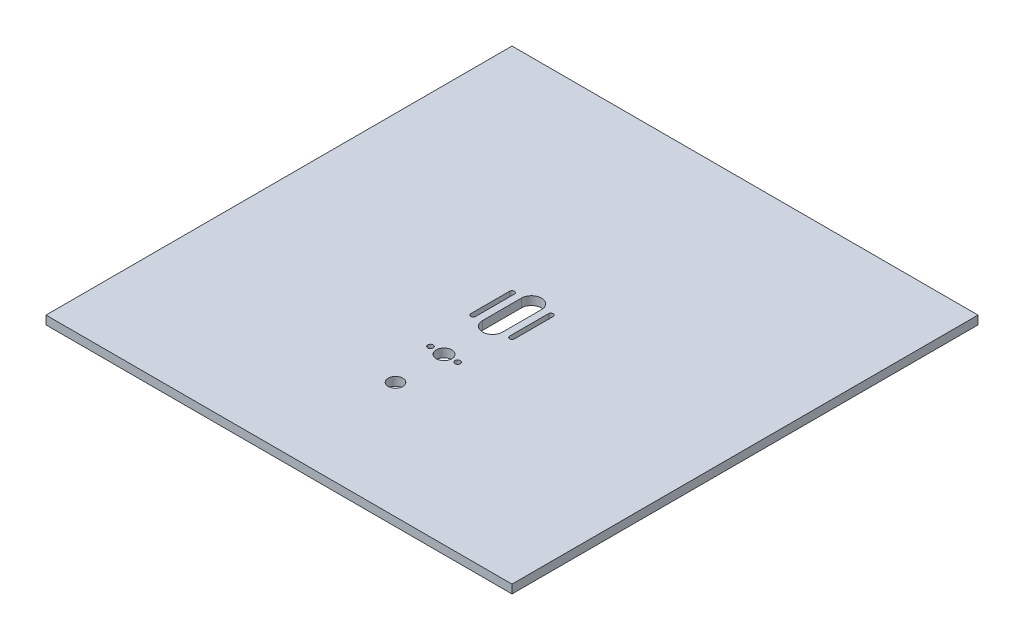
ISO-10303-21;
HEADER;
FILE_DESCRIPTION(('STEP AP214'),'2;1');
FILE_NAME('part.step','',(''),(''),'','','');
FILE_SCHEMA(('AUTOMOTIVE_DESIGN { 1 0 10303 214 1 1 1 1 }'));
ENDSEC;
DATA;
#1=APPLICATION_CONTEXT('core data for automotive mechanical design processes');
#2=APPLICATION_PROTOCOL_DEFINITION('international standard','automotive_design',2000,#1);
#3=PRODUCT_CONTEXT('',#1,'mechanical');
#4=PRODUCT('Part','Part','',(#3));
#5=PRODUCT_RELATED_PRODUCT_CATEGORY('part','',(#4));
#6=PRODUCT_DEFINITION_FORMATION('','',#4);
#7=PRODUCT_DEFINITION_CONTEXT('part definition',#1,'design');
#8=PRODUCT_DEFINITION('design','',#6,#7);
#9=PRODUCT_DEFINITION_SHAPE('','',#8);
#10=(LENGTH_UNIT() NAMED_UNIT(*) SI_UNIT(.MILLI.,.METRE.));
#11=(NAMED_UNIT(*) PLANE_ANGLE_UNIT() SI_UNIT($,.RADIAN.));
#12=(NAMED_UNIT(*) SI_UNIT($,.STERADIAN.) SOLID_ANGLE_UNIT());
#13=UNCERTAINTY_MEASURE_WITH_UNIT(LENGTH_MEASURE(1.E-05),#10,'distance_accuracy_value','');
#14=(GEOMETRIC_REPRESENTATION_CONTEXT(3) GLOBAL_UNCERTAINTY_ASSIGNED_CONTEXT((#13)) GLOBAL_UNIT_ASSIGNED_CONTEXT((#10,
#11,#12)) REPRESENTATION_CONTEXT('',''));
#15=CARTESIAN_POINT('',(0.,0.,0.));
#16=DIRECTION('',(0.,0.,1.));
#17=DIRECTION('',(1.,0.,0.));
#18=AXIS2_PLACEMENT_3D('',#15,#16,#17);
#19=CARTESIAN_POINT('',(152.4,5.588,152.4));
#20=DIRECTION('',(-1.,0.,0.));
#21=DIRECTION('',(0.,0.,1.));
#22=AXIS2_PLACEMENT_3D('',#19,#20,#21);
#23=PLANE('',#22);
#24=DIRECTION('',(0.,0.,-1.));
#25=VECTOR('',#24,1.);
#26=CARTESIAN_POINT('',(152.4,0.,152.4));
#27=LINE('',#26,#25);
#28=CARTESIAN_POINT('',(152.4,0.,152.4));
#29=VERTEX_POINT('',#28);
#30=CARTESIAN_POINT('',(152.4,0.,-152.4));
#31=VERTEX_POINT('',#30);
#32=EDGE_CURVE('E253',#29,#31,#27,.T.);
#33=ORIENTED_EDGE('',*,*,#32,.T.);
#34=DIRECTION('',(0.,-1.,0.));
#35=VECTOR('',#34,1.);
#36=CARTESIAN_POINT('',(152.4,5.588,-152.4));
#37=LINE('',#36,#35);
#38=CARTESIAN_POINT('',(152.4,5.588,-152.4));
#39=VERTEX_POINT('',#38);
#40=EDGE_CURVE('E11',#39,#31,#37,.T.);
#41=ORIENTED_EDGE('',*,*,#40,.F.);
#42=DIRECTION('',(0.,0.,-1.));
#43=VECTOR('',#42,1.);
#44=CARTESIAN_POINT('',(152.4,5.588,152.4));
#45=LINE('',#44,#43);
#46=CARTESIAN_POINT('',(152.4,5.588,152.4));
#47=VERTEX_POINT('',#46);
#48=EDGE_CURVE('E258',#47,#39,#45,.T.);
#49=ORIENTED_EDGE('',*,*,#48,.F.);
#50=DIRECTION('',(0.,-1.,0.));
#51=VECTOR('',#50,1.);
#52=CARTESIAN_POINT('',(152.4,5.588,152.4));
#53=LINE('',#52,#51);
#54=EDGE_CURVE('E268',#47,#29,#53,.T.);
#55=ORIENTED_EDGE('',*,*,#54,.T.);
#56=EDGE_LOOP('',(#33,#41,#49,#55));
#57=FACE_BOUND('',#56,.T.);
#58=ADVANCED_FACE('F33',(#57),#23,.F.);
#59=CARTESIAN_POINT('',(-152.4,5.588,-152.4));
#60=DIRECTION('',(0.,0.,1.));
#61=DIRECTION('',(1.,0.,0.));
#62=AXIS2_PLACEMENT_3D('',#59,#60,#61);
#63=PLANE('',#62);
#64=DIRECTION('',(-1.,0.,0.));
#65=VECTOR('',#64,1.);
#66=CARTESIAN_POINT('',(-152.4,0.,-152.4));
#67=LINE('',#66,#65);
#68=CARTESIAN_POINT('',(-152.4,0.,-152.4));
#69=VERTEX_POINT('',#68);
#70=EDGE_CURVE('E271',#31,#69,#67,.T.);
#71=ORIENTED_EDGE('',*,*,#70,.T.);
#72=DIRECTION('',(0.,-1.,0.));
#73=VECTOR('',#72,1.);
#74=CARTESIAN_POINT('',(-152.4,5.588,-152.4));
#75=LINE('',#74,#73);
#76=CARTESIAN_POINT('',(-152.4,5.588,-152.4));
#77=VERTEX_POINT('',#76);
#78=EDGE_CURVE('E40',#77,#69,#75,.T.);
#79=ORIENTED_EDGE('',*,*,#78,.F.);
#80=DIRECTION('',(-1.,0.,0.));
#81=VECTOR('',#80,1.);
#82=CARTESIAN_POINT('',(-152.4,5.588,-152.4));
#83=LINE('',#82,#81);
#84=EDGE_CURVE('E261',#39,#77,#83,.T.);
#85=ORIENTED_EDGE('',*,*,#84,.F.);
#86=ORIENTED_EDGE('',*,*,#40,.T.);
#87=EDGE_LOOP('',(#71,#79,#85,#86));
#88=FACE_BOUND('',#87,.T.);
#89=ADVANCED_FACE('F300',(#88),#63,.F.);
#90=CARTESIAN_POINT('',(-152.4,5.588,152.4));
#91=DIRECTION('',(1.,0.,0.));
#92=DIRECTION('',(0.,0.,-1.));
#93=AXIS2_PLACEMENT_3D('',#90,#91,#92);
#94=PLANE('',#93);
#95=DIRECTION('',(0.,0.,1.));
#96=VECTOR('',#95,1.);
#97=CARTESIAN_POINT('',(-152.4,0.,152.4));
#98=LINE('',#97,#96);
#99=CARTESIAN_POINT('',(-152.4,0.,152.4));
#100=VERTEX_POINT('',#99);
#101=EDGE_CURVE('E273',#69,#100,#98,.T.);
#102=ORIENTED_EDGE('',*,*,#101,.T.);
#103=DIRECTION('',(0.,-1.,0.));
#104=VECTOR('',#103,1.);
#105=CARTESIAN_POINT('',(-152.4,5.588,152.4));
#106=LINE('',#105,#104);
#107=CARTESIAN_POINT('',(-152.4,5.588,152.4));
#108=VERTEX_POINT('',#107);
#109=EDGE_CURVE('E278',#108,#100,#106,.T.);
#110=ORIENTED_EDGE('',*,*,#109,.F.);
#111=DIRECTION('',(0.,0.,1.));
#112=VECTOR('',#111,1.);
#113=CARTESIAN_POINT('',(-152.4,5.588,152.4));
#114=LINE('',#113,#112);
#115=EDGE_CURVE('E264',#77,#108,#114,.T.);
#116=ORIENTED_EDGE('',*,*,#115,.F.);
#117=ORIENTED_EDGE('',*,*,#78,.T.);
#118=EDGE_LOOP('',(#102,#110,#116,#117));
#119=FACE_BOUND('',#118,.T.);
#120=ADVANCED_FACE('F285',(#119),#94,.F.);
#121=CARTESIAN_POINT('',(-152.4,5.588,152.4));
#122=DIRECTION('',(0.,0.,-1.));
#123=DIRECTION('',(-1.,0.,0.));
#124=AXIS2_PLACEMENT_3D('',#121,#122,#123);
#125=PLANE('',#124);
#126=DIRECTION('',(1.,0.,0.));
#127=VECTOR('',#126,1.);
#128=CARTESIAN_POINT('',(-152.4,0.,152.4));
#129=LINE('',#128,#127);
#130=EDGE_CURVE('E262',#100,#29,#129,.T.);
#131=ORIENTED_EDGE('',*,*,#130,.T.);
#132=ORIENTED_EDGE('',*,*,#54,.F.);
#133=DIRECTION('',(1.,0.,0.));
#134=VECTOR('',#133,1.);
#135=CARTESIAN_POINT('',(-152.4,5.588,152.4));
#136=LINE('',#135,#134);
#137=EDGE_CURVE('E266',#108,#47,#136,.T.);
#138=ORIENTED_EDGE('',*,*,#137,.F.);
#139=ORIENTED_EDGE('',*,*,#109,.T.);
#140=EDGE_LOOP('',(#131,#132,#138,#139));
#141=FACE_BOUND('',#140,.T.);
#142=ADVANCED_FACE('F293',(#141),#125,.F.);
#143=CARTESIAN_POINT('',(0.,5.588,0.));
#144=DIRECTION('',(0.,-1.,0.));
#145=DIRECTION('',(0.,0.,-1.));
#146=AXIS2_PLACEMENT_3D('',#143,#144,#145);
#147=PLANE('',#146);
#148=CARTESIAN_POINT('',(8.89,5.588,44.45));
#149=DIRECTION('',(0.,1.,0.));
#150=DIRECTION('',(0.,0.,1.));
#151=AXIS2_PLACEMENT_3D('',#148,#149,#150);
#152=CIRCLE('',#151,1.778);
#153=CARTESIAN_POINT('',(8.89,5.588,46.228));
#154=VERTEX_POINT('',#153);
#155=EDGE_CURVE('E243',#154,#154,#152,.T.);
#156=ORIENTED_EDGE('',*,*,#155,.F.);
#157=EDGE_LOOP('',(#156));
#158=FACE_BOUND('',#157,.T.);
#159=CARTESIAN_POINT('',(-8.89,5.588,44.45));
#160=DIRECTION('',(0.,1.,0.));
#161=DIRECTION('',(0.,0.,1.));
#162=AXIS2_PLACEMENT_3D('',#159,#160,#161);
#163=CIRCLE('',#162,1.77799999999999);
#164=CARTESIAN_POINT('',(-8.89,5.588,46.228));
#165=VERTEX_POINT('',#164);
#166=EDGE_CURVE('E382',#165,#165,#163,.T.);
#167=ORIENTED_EDGE('',*,*,#166,.F.);
#168=EDGE_LOOP('',(#167));
#169=FACE_BOUND('',#168,.T.);
#170=CARTESIAN_POINT('',(0.,5.588,44.45));
#171=DIRECTION('',(0.,1.,0.));
#172=DIRECTION('',(0.,0.,1.));
#173=AXIS2_PLACEMENT_3D('',#170,#171,#172);
#174=CIRCLE('',#173,5.08000000000001);
#175=CARTESIAN_POINT('',(0.,5.588,49.53));
#176=VERTEX_POINT('',#175);
#177=EDGE_CURVE('E172',#176,#176,#174,.T.);
#178=ORIENTED_EDGE('',*,*,#177,.F.);
#179=EDGE_LOOP('',(#178));
#180=FACE_BOUND('',#179,.T.);
#181=DIRECTION('',(0.,0.,1.));
#182=VECTOR('',#181,1.);
#183=CARTESIAN_POINT('',(11.1125,5.588,-12.7));
#184=LINE('',#183,#182);
#185=CARTESIAN_POINT('',(11.1125,5.588,-12.7));
#186=VERTEX_POINT('',#185);
#187=CARTESIAN_POINT('',(11.1125,5.588,12.7));
#188=VERTEX_POINT('',#187);
#189=EDGE_CURVE('E204',#186,#188,#184,.T.);
#190=ORIENTED_EDGE('',*,*,#189,.F.);
#191=CARTESIAN_POINT('',(12.7,5.588,-12.7));
#192=DIRECTION('',(0.,1.,0.));
#193=DIRECTION('',(0.,0.,1.));
#194=AXIS2_PLACEMENT_3D('',#191,#192,#193);
#195=CIRCLE('',#194,1.5875);
#196=CARTESIAN_POINT('',(14.2875,5.588,-12.7));
#197=VERTEX_POINT('',#196);
#198=EDGE_CURVE('E47',#197,#186,#195,.T.);
#199=ORIENTED_EDGE('',*,*,#198,.F.);
#200=DIRECTION('',(0.,0.,-1.));
#201=VECTOR('',#200,1.);
#202=CARTESIAN_POINT('',(14.2875,5.588,-12.7));
#203=LINE('',#202,#201);
#204=CARTESIAN_POINT('',(14.2875,5.588,12.7));
#205=VERTEX_POINT('',#204);
#206=EDGE_CURVE('E193',#205,#197,#203,.T.);
#207=ORIENTED_EDGE('',*,*,#206,.F.);
#208=CARTESIAN_POINT('',(12.7,5.588,12.7));
#209=DIRECTION('',(0.,1.,0.));
#210=DIRECTION('',(0.,0.,1.));
#211=AXIS2_PLACEMENT_3D('',#208,#209,#210);
#212=CIRCLE('',#211,1.5875);
#213=EDGE_CURVE('E207',#188,#205,#212,.T.);
#214=ORIENTED_EDGE('',*,*,#213,.F.);
#215=EDGE_LOOP('',(#190,#199,#207,#214));
#216=FACE_BOUND('',#215,.T.);
#217=DIRECTION('',(0.,0.,1.));
#218=VECTOR('',#217,1.);
#219=CARTESIAN_POINT('',(-14.2875,5.588,-12.7));
#220=LINE('',#219,#218);
#221=CARTESIAN_POINT('',(-14.2875,5.588,-12.7));
#222=VERTEX_POINT('',#221);
#223=CARTESIAN_POINT('',(-14.2875,5.588,12.7));
#224=VERTEX_POINT('',#223);
#225=EDGE_CURVE('E178',#222,#224,#220,.T.);
#226=ORIENTED_EDGE('',*,*,#225,.F.);
#227=CARTESIAN_POINT('',(-12.7,5.588,-12.7));
#228=DIRECTION('',(0.,1.,0.));
#229=DIRECTION('',(0.,0.,1.));
#230=AXIS2_PLACEMENT_3D('',#227,#228,#229);
#231=CIRCLE('',#230,1.5875);
#232=CARTESIAN_POINT('',(-11.1125,5.588,-12.7));
#233=VERTEX_POINT('',#232);
#234=EDGE_CURVE('E55',#233,#222,#231,.T.);
#235=ORIENTED_EDGE('',*,*,#234,.F.);
#236=DIRECTION('',(0.,0.,-1.));
#237=VECTOR('',#236,1.);
#238=CARTESIAN_POINT('',(-11.1125,5.588,-12.7));
#239=LINE('',#238,#237);
#240=CARTESIAN_POINT('',(-11.1125,5.588,12.7));
#241=VERTEX_POINT('',#240);
#242=EDGE_CURVE('E166',#241,#233,#239,.T.);
#243=ORIENTED_EDGE('',*,*,#242,.F.);
#244=CARTESIAN_POINT('',(-12.7,5.588,12.7));
#245=DIRECTION('',(0.,1.,0.));
#246=DIRECTION('',(0.,0.,1.));
#247=AXIS2_PLACEMENT_3D('',#244,#245,#246);
#248=CIRCLE('',#247,1.5875);
#249=EDGE_CURVE('E169',#224,#241,#248,.T.);
#250=ORIENTED_EDGE('',*,*,#249,.F.);
#251=EDGE_LOOP('',(#226,#235,#243,#250));
#252=FACE_BOUND('',#251,.T.);
#253=DIRECTION('',(0.,0.,1.));
#254=VECTOR('',#253,1.);
#255=CARTESIAN_POINT('',(-6.54049999999997,5.588,-12.7));
#256=LINE('',#255,#254);
#257=CARTESIAN_POINT('',(-6.54049999999997,5.588,-12.7));
#258=VERTEX_POINT('',#257);
#259=CARTESIAN_POINT('',(-6.54049999999999,5.588,12.7));
#260=VERTEX_POINT('',#259);
#261=EDGE_CURVE('E233',#258,#260,#256,.T.);
#262=ORIENTED_EDGE('',*,*,#261,.F.);
#263=CARTESIAN_POINT('',(0.,5.588,-12.7));
#264=DIRECTION('',(0.,1.,0.));
#265=DIRECTION('',(0.,0.,1.));
#266=AXIS2_PLACEMENT_3D('',#263,#264,#265);
#267=CIRCLE('',#266,6.54049999999998);
#268=CARTESIAN_POINT('',(6.54049999999999,5.588,-12.7));
#269=VERTEX_POINT('',#268);
#270=EDGE_CURVE('E185',#269,#258,#267,.T.);
#271=ORIENTED_EDGE('',*,*,#270,.F.);
#272=DIRECTION('',(0.,0.,-1.));
#273=VECTOR('',#272,1.);
#274=CARTESIAN_POINT('',(6.54049999999999,5.588,-12.7));
#275=LINE('',#274,#273);
#276=CARTESIAN_POINT('',(6.5405,5.588,12.7));
#277=VERTEX_POINT('',#276);
#278=EDGE_CURVE('E222',#277,#269,#275,.T.);
#279=ORIENTED_EDGE('',*,*,#278,.F.);
#280=CARTESIAN_POINT('',(0.,5.588,12.7));
#281=DIRECTION('',(0.,1.,0.));
#282=DIRECTION('',(0.,0.,1.));
#283=AXIS2_PLACEMENT_3D('',#280,#281,#282);
#284=CIRCLE('',#283,6.54049999999999);
#285=EDGE_CURVE('E236',#260,#277,#284,.T.);
#286=ORIENTED_EDGE('',*,*,#285,.F.);
#287=EDGE_LOOP('',(#262,#271,#279,#286));
#288=FACE_BOUND('',#287,.T.);
#289=CARTESIAN_POINT('',(0.,5.588,76.2));
#290=DIRECTION('',(0.,1.,0.));
#291=DIRECTION('',(0.,0.,1.));
#292=AXIS2_PLACEMENT_3D('',#289,#290,#291);
#293=CIRCLE('',#292,4.76249999999999);
#294=CARTESIAN_POINT('',(0.,5.588,80.9625));
#295=VERTEX_POINT('',#294);
#296=EDGE_CURVE('E254',#295,#295,#293,.T.);
#297=ORIENTED_EDGE('',*,*,#296,.F.);
#298=EDGE_LOOP('',(#297));
#299=FACE_BOUND('',#298,.T.);
#300=ORIENTED_EDGE('',*,*,#48,.T.);
#301=ORIENTED_EDGE('',*,*,#84,.T.);
#302=ORIENTED_EDGE('',*,*,#115,.T.);
#303=ORIENTED_EDGE('',*,*,#137,.T.);
#304=EDGE_LOOP('',(#300,#301,#302,#303));
#305=FACE_BOUND('',#304,.T.);
#306=ADVANCED_FACE('F299',(#158,#169,#180,#216,#252,#288,#299,#305),#147,.F.);
#307=CARTESIAN_POINT('',(0.,0.,0.));
#308=DIRECTION('',(0.,-1.,0.));
#309=DIRECTION('',(0.,0.,-1.));
#310=AXIS2_PLACEMENT_3D('',#307,#308,#309);
#311=PLANE('',#310);
#312=CARTESIAN_POINT('',(8.89,0.,44.45));
#313=DIRECTION('',(0.,1.,0.));
#314=DIRECTION('',(0.,0.,1.));
#315=AXIS2_PLACEMENT_3D('',#312,#313,#314);
#316=CIRCLE('',#315,1.778);
#317=CARTESIAN_POINT('',(8.89,0.,46.228));
#318=VERTEX_POINT('',#317);
#319=EDGE_CURVE('E384',#318,#318,#316,.T.);
#320=ORIENTED_EDGE('',*,*,#319,.T.);
#321=EDGE_LOOP('',(#320));
#322=FACE_BOUND('',#321,.T.);
#323=CARTESIAN_POINT('',(-8.89,0.,44.45));
#324=DIRECTION('',(0.,1.,0.));
#325=DIRECTION('',(0.,0.,1.));
#326=AXIS2_PLACEMENT_3D('',#323,#324,#325);
#327=CIRCLE('',#326,1.77799999999999);
#328=CARTESIAN_POINT('',(-8.89,0.,46.228));
#329=VERTEX_POINT('',#328);
#330=EDGE_CURVE('E379',#329,#329,#327,.T.);
#331=ORIENTED_EDGE('',*,*,#330,.T.);
#332=EDGE_LOOP('',(#331));
#333=FACE_BOUND('',#332,.T.);
#334=CARTESIAN_POINT('',(0.,0.,44.45));
#335=DIRECTION('',(0.,1.,0.));
#336=DIRECTION('',(0.,0.,1.));
#337=AXIS2_PLACEMENT_3D('',#334,#335,#336);
#338=CIRCLE('',#337,5.08000000000001);
#339=CARTESIAN_POINT('',(0.,0.,49.53));
#340=VERTEX_POINT('',#339);
#341=EDGE_CURVE('E257',#340,#340,#338,.T.);
#342=ORIENTED_EDGE('',*,*,#341,.T.);
#343=EDGE_LOOP('',(#342));
#344=FACE_BOUND('',#343,.T.);
#345=CARTESIAN_POINT('',(12.7,0.,-12.7));
#346=DIRECTION('',(0.,1.,0.));
#347=DIRECTION('',(0.,0.,1.));
#348=AXIS2_PLACEMENT_3D('',#345,#346,#347);
#349=CIRCLE('',#348,1.5875);
#350=CARTESIAN_POINT('',(14.2875,0.,-12.7));
#351=VERTEX_POINT('',#350);
#352=CARTESIAN_POINT('',(11.1125,0.,-12.7));
#353=VERTEX_POINT('',#352);
#354=EDGE_CURVE('E189',#351,#353,#349,.T.);
#355=ORIENTED_EDGE('',*,*,#354,.T.);
#356=DIRECTION('',(0.,0.,1.));
#357=VECTOR('',#356,1.);
#358=CARTESIAN_POINT('',(11.1125,0.,-12.7));
#359=LINE('',#358,#357);
#360=CARTESIAN_POINT('',(11.1125,0.,12.7));
#361=VERTEX_POINT('',#360);
#362=EDGE_CURVE('E192',#353,#361,#359,.T.);
#363=ORIENTED_EDGE('',*,*,#362,.T.);
#364=CARTESIAN_POINT('',(12.7,0.,12.7));
#365=DIRECTION('',(0.,1.,0.));
#366=DIRECTION('',(0.,0.,1.));
#367=AXIS2_PLACEMENT_3D('',#364,#365,#366);
#368=CIRCLE('',#367,1.5875);
#369=CARTESIAN_POINT('',(14.2875,0.,12.7));
#370=VERTEX_POINT('',#369);
#371=EDGE_CURVE('E196',#361,#370,#368,.T.);
#372=ORIENTED_EDGE('',*,*,#371,.T.);
#373=DIRECTION('',(0.,0.,-1.));
#374=VECTOR('',#373,1.);
#375=CARTESIAN_POINT('',(14.2875,0.,-12.7));
#376=LINE('',#375,#374);
#377=EDGE_CURVE('E199',#370,#351,#376,.T.);
#378=ORIENTED_EDGE('',*,*,#377,.T.);
#379=EDGE_LOOP('',(#355,#363,#372,#378));
#380=FACE_BOUND('',#379,.T.);
#381=CARTESIAN_POINT('',(-12.7,0.,-12.7));
#382=DIRECTION('',(0.,1.,0.));
#383=DIRECTION('',(0.,0.,1.));
#384=AXIS2_PLACEMENT_3D('',#381,#382,#383);
#385=CIRCLE('',#384,1.5875);
#386=CARTESIAN_POINT('',(-11.1125,0.,-12.7));
#387=VERTEX_POINT('',#386);
#388=CARTESIAN_POINT('',(-14.2875,0.,-12.7));
#389=VERTEX_POINT('',#388);
#390=EDGE_CURVE('E147',#387,#389,#385,.T.);
#391=ORIENTED_EDGE('',*,*,#390,.T.);
#392=DIRECTION('',(0.,0.,1.));
#393=VECTOR('',#392,1.);
#394=CARTESIAN_POINT('',(-14.2875,0.,-12.7));
#395=LINE('',#394,#393);
#396=CARTESIAN_POINT('',(-14.2875,0.,12.7));
#397=VERTEX_POINT('',#396);
#398=EDGE_CURVE('E157',#389,#397,#395,.T.);
#399=ORIENTED_EDGE('',*,*,#398,.T.);
#400=CARTESIAN_POINT('',(-12.7,0.,12.7));
#401=DIRECTION('',(0.,1.,0.));
#402=DIRECTION('',(0.,0.,1.));
#403=AXIS2_PLACEMENT_3D('',#400,#401,#402);
#404=CIRCLE('',#403,1.5875);
#405=CARTESIAN_POINT('',(-11.1125,0.,12.7));
#406=VERTEX_POINT('',#405);
#407=EDGE_CURVE('E161',#397,#406,#404,.T.);
#408=ORIENTED_EDGE('',*,*,#407,.T.);
#409=DIRECTION('',(0.,0.,-1.));
#410=VECTOR('',#409,1.);
#411=CARTESIAN_POINT('',(-11.1125,0.,-12.7));
#412=LINE('',#411,#410);
#413=EDGE_CURVE('E153',#406,#387,#412,.T.);
#414=ORIENTED_EDGE('',*,*,#413,.T.);
#415=EDGE_LOOP('',(#391,#399,#408,#414));
#416=FACE_BOUND('',#415,.T.);
#417=CARTESIAN_POINT('',(0.,0.,-12.7));
#418=DIRECTION('',(0.,1.,0.));
#419=DIRECTION('',(0.,0.,1.));
#420=AXIS2_PLACEMENT_3D('',#417,#418,#419);
#421=CIRCLE('',#420,6.54049999999998);
#422=CARTESIAN_POINT('',(6.54049999999999,0.,-12.7));
#423=VERTEX_POINT('',#422);
#424=CARTESIAN_POINT('',(-6.54049999999997,0.,-12.7));
#425=VERTEX_POINT('',#424);
#426=EDGE_CURVE('E218',#423,#425,#421,.T.);
#427=ORIENTED_EDGE('',*,*,#426,.T.);
#428=DIRECTION('',(0.,0.,1.));
#429=VECTOR('',#428,1.);
#430=CARTESIAN_POINT('',(-6.54049999999997,0.,-12.7));
#431=LINE('',#430,#429);
#432=CARTESIAN_POINT('',(-6.54049999999998,0.,12.7));
#433=VERTEX_POINT('',#432);
#434=EDGE_CURVE('E221',#425,#433,#431,.T.);
#435=ORIENTED_EDGE('',*,*,#434,.T.);
#436=CARTESIAN_POINT('',(0.,0.,12.7));
#437=DIRECTION('',(0.,1.,0.));
#438=DIRECTION('',(0.,0.,1.));
#439=AXIS2_PLACEMENT_3D('',#436,#437,#438);
#440=CIRCLE('',#439,6.54049999999999);
#441=CARTESIAN_POINT('',(6.5405,0.,12.7));
#442=VERTEX_POINT('',#441);
#443=EDGE_CURVE('E225',#433,#442,#440,.T.);
#444=ORIENTED_EDGE('',*,*,#443,.T.);
#445=DIRECTION('',(0.,0.,-1.));
#446=VECTOR('',#445,1.);
#447=CARTESIAN_POINT('',(6.54049999999999,0.,-12.7));
#448=LINE('',#447,#446);
#449=EDGE_CURVE('E228',#442,#423,#448,.T.);
#450=ORIENTED_EDGE('',*,*,#449,.T.);
#451=EDGE_LOOP('',(#427,#435,#444,#450));
#452=FACE_BOUND('',#451,.T.);
#453=CARTESIAN_POINT('',(0.,0.,76.2));
#454=DIRECTION('',(0.,1.,0.));
#455=DIRECTION('',(0.,0.,1.));
#456=AXIS2_PLACEMENT_3D('',#453,#454,#455);
#457=CIRCLE('',#456,4.76249999999999);
#458=CARTESIAN_POINT('',(0.,0.,80.9625));
#459=VERTEX_POINT('',#458);
#460=EDGE_CURVE('E250',#459,#459,#457,.T.);
#461=ORIENTED_EDGE('',*,*,#460,.T.);
#462=EDGE_LOOP('',(#461));
#463=FACE_BOUND('',#462,.T.);
#464=ORIENTED_EDGE('',*,*,#32,.F.);
#465=ORIENTED_EDGE('',*,*,#130,.F.);
#466=ORIENTED_EDGE('',*,*,#101,.F.);
#467=ORIENTED_EDGE('',*,*,#70,.F.);
#468=EDGE_LOOP('',(#464,#465,#466,#467));
#469=FACE_BOUND('',#468,.T.);
#470=ADVANCED_FACE('F163',(#322,#333,#344,#380,#416,#452,#463,#469),#311,.T.);
#471=CARTESIAN_POINT('',(0.,0.,76.2));
#472=DIRECTION('',(0.,1.,0.));
#473=DIRECTION('',(0.,0.,1.));
#474=AXIS2_PLACEMENT_3D('',#471,#472,#473);
#475=CYLINDRICAL_SURFACE('',#474,4.76249999999999);
#476=ORIENTED_EDGE('',*,*,#460,.F.);
#477=EDGE_LOOP('',(#476));
#478=FACE_BOUND('',#477,.T.);
#479=ORIENTED_EDGE('',*,*,#296,.T.);
#480=EDGE_LOOP('',(#479));
#481=FACE_BOUND('',#480,.T.);
#482=ADVANCED_FACE('F312',(#478,#481),#475,.F.);
#483=CARTESIAN_POINT('',(0.,0.,-12.7));
#484=DIRECTION('',(0.,1.,0.));
#485=DIRECTION('',(0.,0.,1.));
#486=AXIS2_PLACEMENT_3D('',#483,#484,#485);
#487=CYLINDRICAL_SURFACE('',#486,6.54049999999998);
#488=ORIENTED_EDGE('',*,*,#270,.T.);
#489=DIRECTION('',(0.,1.,0.));
#490=VECTOR('',#489,1.);
#491=CARTESIAN_POINT('',(-6.54049999999997,0.,-12.7));
#492=LINE('',#491,#490);
#493=EDGE_CURVE('E231',#425,#258,#492,.T.);
#494=ORIENTED_EDGE('',*,*,#493,.F.);
#495=ORIENTED_EDGE('',*,*,#426,.F.);
#496=DIRECTION('',(0.,1.,0.));
#497=VECTOR('',#496,1.);
#498=CARTESIAN_POINT('',(6.54049999999999,0.,-12.7));
#499=LINE('',#498,#497);
#500=EDGE_CURVE('E241',#423,#269,#499,.T.);
#501=ORIENTED_EDGE('',*,*,#500,.T.);
#502=EDGE_LOOP('',(#488,#494,#495,#501));
#503=FACE_BOUND('',#502,.T.);
#504=ADVANCED_FACE('F319',(#503),#487,.F.);
#505=CARTESIAN_POINT('',(6.54049999999999,0.,-12.7));
#506=DIRECTION('',(1.,0.,0.));
#507=DIRECTION('',(0.,0.,-1.));
#508=AXIS2_PLACEMENT_3D('',#505,#506,#507);
#509=PLANE('',#508);
#510=ORIENTED_EDGE('',*,*,#278,.T.);
#511=ORIENTED_EDGE('',*,*,#500,.F.);
#512=ORIENTED_EDGE('',*,*,#449,.F.);
#513=DIRECTION('',(0.,1.,0.));
#514=VECTOR('',#513,1.);
#515=CARTESIAN_POINT('',(6.5405,0.,12.7));
#516=LINE('',#515,#514);
#517=EDGE_CURVE('E244',#442,#277,#516,.T.);
#518=ORIENTED_EDGE('',*,*,#517,.T.);
#519=EDGE_LOOP('',(#510,#511,#512,#518));
#520=FACE_BOUND('',#519,.T.);
#521=ADVANCED_FACE('F323',(#520),#509,.F.);
#522=CARTESIAN_POINT('',(0.,0.,12.7));
#523=DIRECTION('',(0.,1.,0.));
#524=DIRECTION('',(0.,0.,1.));
#525=AXIS2_PLACEMENT_3D('',#522,#523,#524);
#526=CYLINDRICAL_SURFACE('',#525,6.54049999999999);
#527=ORIENTED_EDGE('',*,*,#285,.T.);
#528=ORIENTED_EDGE('',*,*,#517,.F.);
#529=ORIENTED_EDGE('',*,*,#443,.F.);
#530=DIRECTION('',(0.,1.,0.));
#531=VECTOR('',#530,1.);
#532=CARTESIAN_POINT('',(-6.54049999999999,0.,12.7));
#533=LINE('',#532,#531);
#534=EDGE_CURVE('E246',#433,#260,#533,.T.);
#535=ORIENTED_EDGE('',*,*,#534,.T.);
#536=EDGE_LOOP('',(#527,#528,#529,#535));
#537=FACE_BOUND('',#536,.T.);
#538=ADVANCED_FACE('F328',(#537),#526,.F.);
#539=CARTESIAN_POINT('',(-6.54049999999997,0.,-12.7));
#540=DIRECTION('',(-1.,0.,0.));
#541=DIRECTION('',(0.,0.,1.));
#542=AXIS2_PLACEMENT_3D('',#539,#540,#541);
#543=PLANE('',#542);
#544=ORIENTED_EDGE('',*,*,#261,.T.);
#545=ORIENTED_EDGE('',*,*,#534,.F.);
#546=ORIENTED_EDGE('',*,*,#434,.F.);
#547=ORIENTED_EDGE('',*,*,#493,.T.);
#548=EDGE_LOOP('',(#544,#545,#546,#547));
#549=FACE_BOUND('',#548,.T.);
#550=ADVANCED_FACE('F325',(#549),#543,.F.);
#551=CARTESIAN_POINT('',(-12.7,0.,-12.7));
#552=DIRECTION('',(0.,1.,0.));
#553=DIRECTION('',(0.,0.,1.));
#554=AXIS2_PLACEMENT_3D('',#551,#552,#553);
#555=CYLINDRICAL_SURFACE('',#554,1.5875);
#556=ORIENTED_EDGE('',*,*,#234,.T.);
#557=DIRECTION('',(0.,1.,0.));
#558=VECTOR('',#557,1.);
#559=CARTESIAN_POINT('',(-14.2875,0.,-12.7));
#560=LINE('',#559,#558);
#561=EDGE_CURVE('E143',#389,#222,#560,.T.);
#562=ORIENTED_EDGE('',*,*,#561,.F.);
#563=ORIENTED_EDGE('',*,*,#390,.F.);
#564=DIRECTION('',(0.,1.,0.));
#565=VECTOR('',#564,1.);
#566=CARTESIAN_POINT('',(-11.1125,0.,-12.7));
#567=LINE('',#566,#565);
#568=EDGE_CURVE('E183',#387,#233,#567,.T.);
#569=ORIENTED_EDGE('',*,*,#568,.T.);
#570=EDGE_LOOP('',(#556,#562,#563,#569));
#571=FACE_BOUND('',#570,.T.);
#572=ADVANCED_FACE('F145',(#571),#555,.F.);
#573=CARTESIAN_POINT('',(-11.1125,0.,-12.7));
#574=DIRECTION('',(1.,0.,0.));
#575=DIRECTION('',(0.,0.,-1.));
#576=AXIS2_PLACEMENT_3D('',#573,#574,#575);
#577=PLANE('',#576);
#578=ORIENTED_EDGE('',*,*,#242,.T.);
#579=ORIENTED_EDGE('',*,*,#568,.F.);
#580=ORIENTED_EDGE('',*,*,#413,.F.);
#581=DIRECTION('',(0.,1.,0.));
#582=VECTOR('',#581,1.);
#583=CARTESIAN_POINT('',(-11.1125,0.,12.7));
#584=LINE('',#583,#582);
#585=EDGE_CURVE('E186',#406,#241,#584,.T.);
#586=ORIENTED_EDGE('',*,*,#585,.T.);
#587=EDGE_LOOP('',(#578,#579,#580,#586));
#588=FACE_BOUND('',#587,.T.);
#589=ADVANCED_FACE('F354',(#588),#577,.F.);
#590=CARTESIAN_POINT('',(-12.7,0.,12.7));
#591=DIRECTION('',(0.,1.,0.));
#592=DIRECTION('',(0.,0.,1.));
#593=AXIS2_PLACEMENT_3D('',#590,#591,#592);
#594=CYLINDRICAL_SURFACE('',#593,1.5875);
#595=ORIENTED_EDGE('',*,*,#249,.T.);
#596=ORIENTED_EDGE('',*,*,#585,.F.);
#597=ORIENTED_EDGE('',*,*,#407,.F.);
#598=DIRECTION('',(0.,1.,0.));
#599=VECTOR('',#598,1.);
#600=CARTESIAN_POINT('',(-14.2875,0.,12.7));
#601=LINE('',#600,#599);
#602=EDGE_CURVE('E152',#397,#224,#601,.T.);
#603=ORIENTED_EDGE('',*,*,#602,.T.);
#604=EDGE_LOOP('',(#595,#596,#597,#603));
#605=FACE_BOUND('',#604,.T.);
#606=ADVANCED_FACE('F357',(#605),#594,.F.);
#607=CARTESIAN_POINT('',(-14.2875,0.,-12.7));
#608=DIRECTION('',(-1.,0.,0.));
#609=DIRECTION('',(0.,0.,1.));
#610=AXIS2_PLACEMENT_3D('',#607,#608,#609);
#611=PLANE('',#610);
#612=ORIENTED_EDGE('',*,*,#225,.T.);
#613=ORIENTED_EDGE('',*,*,#602,.F.);
#614=ORIENTED_EDGE('',*,*,#398,.F.);
#615=ORIENTED_EDGE('',*,*,#561,.T.);
#616=EDGE_LOOP('',(#612,#613,#614,#615));
#617=FACE_BOUND('',#616,.T.);
#618=ADVANCED_FACE('F158',(#617),#611,.F.);
#619=CARTESIAN_POINT('',(12.7,0.,-12.7));
#620=DIRECTION('',(0.,1.,0.));
#621=DIRECTION('',(0.,0.,1.));
#622=AXIS2_PLACEMENT_3D('',#619,#620,#621);
#623=CYLINDRICAL_SURFACE('',#622,1.5875);
#624=ORIENTED_EDGE('',*,*,#198,.T.);
#625=DIRECTION('',(0.,1.,0.));
#626=VECTOR('',#625,1.);
#627=CARTESIAN_POINT('',(11.1125,0.,-12.7));
#628=LINE('',#627,#626);
#629=EDGE_CURVE('E202',#353,#186,#628,.T.);
#630=ORIENTED_EDGE('',*,*,#629,.F.);
#631=ORIENTED_EDGE('',*,*,#354,.F.);
#632=DIRECTION('',(0.,1.,0.));
#633=VECTOR('',#632,1.);
#634=CARTESIAN_POINT('',(14.2875,0.,-12.7));
#635=LINE('',#634,#633);
#636=EDGE_CURVE('E179',#351,#197,#635,.T.);
#637=ORIENTED_EDGE('',*,*,#636,.T.);
#638=EDGE_LOOP('',(#624,#630,#631,#637));
#639=FACE_BOUND('',#638,.T.);
#640=ADVANCED_FACE('F336',(#639),#623,.F.);
#641=CARTESIAN_POINT('',(14.2875,0.,-12.7));
#642=DIRECTION('',(1.,0.,0.));
#643=DIRECTION('',(0.,0.,-1.));
#644=AXIS2_PLACEMENT_3D('',#641,#642,#643);
#645=PLANE('',#644);
#646=ORIENTED_EDGE('',*,*,#206,.T.);
#647=ORIENTED_EDGE('',*,*,#636,.F.);
#648=ORIENTED_EDGE('',*,*,#377,.F.);
#649=DIRECTION('',(0.,1.,0.));
#650=VECTOR('',#649,1.);
#651=CARTESIAN_POINT('',(14.2875,0.,12.7));
#652=LINE('',#651,#650);
#653=EDGE_CURVE('E213',#370,#205,#652,.T.);
#654=ORIENTED_EDGE('',*,*,#653,.T.);
#655=EDGE_LOOP('',(#646,#647,#648,#654));
#656=FACE_BOUND('',#655,.T.);
#657=ADVANCED_FACE('F339',(#656),#645,.F.);
#658=CARTESIAN_POINT('',(12.7,0.,12.7));
#659=DIRECTION('',(0.,1.,0.));
#660=DIRECTION('',(0.,0.,1.));
#661=AXIS2_PLACEMENT_3D('',#658,#659,#660);
#662=CYLINDRICAL_SURFACE('',#661,1.5875);
#663=ORIENTED_EDGE('',*,*,#213,.T.);
#664=ORIENTED_EDGE('',*,*,#653,.F.);
#665=ORIENTED_EDGE('',*,*,#371,.F.);
#666=DIRECTION('',(0.,1.,0.));
#667=VECTOR('',#666,1.);
#668=CARTESIAN_POINT('',(11.1125,0.,12.7));
#669=LINE('',#668,#667);
#670=EDGE_CURVE('E215',#361,#188,#669,.T.);
#671=ORIENTED_EDGE('',*,*,#670,.T.);
#672=EDGE_LOOP('',(#663,#664,#665,#671));
#673=FACE_BOUND('',#672,.T.);
#674=ADVANCED_FACE('F344',(#673),#662,.F.);
#675=CARTESIAN_POINT('',(11.1125,0.,-12.7));
#676=DIRECTION('',(-1.,0.,0.));
#677=DIRECTION('',(0.,0.,1.));
#678=AXIS2_PLACEMENT_3D('',#675,#676,#677);
#679=PLANE('',#678);
#680=ORIENTED_EDGE('',*,*,#189,.T.);
#681=ORIENTED_EDGE('',*,*,#670,.F.);
#682=ORIENTED_EDGE('',*,*,#362,.F.);
#683=ORIENTED_EDGE('',*,*,#629,.T.);
#684=EDGE_LOOP('',(#680,#681,#682,#683));
#685=FACE_BOUND('',#684,.T.);
#686=ADVANCED_FACE('F340',(#685),#679,.F.);
#687=CARTESIAN_POINT('',(0.,0.,44.45));
#688=DIRECTION('',(0.,1.,0.));
#689=DIRECTION('',(0.,0.,1.));
#690=AXIS2_PLACEMENT_3D('',#687,#688,#689);
#691=CYLINDRICAL_SURFACE('',#690,5.08000000000001);
#692=ORIENTED_EDGE('',*,*,#341,.F.);
#693=EDGE_LOOP('',(#692));
#694=FACE_BOUND('',#693,.T.);
#695=ORIENTED_EDGE('',*,*,#177,.T.);
#696=EDGE_LOOP('',(#695));
#697=FACE_BOUND('',#696,.T.);
#698=ADVANCED_FACE('F343',(#694,#697),#691,.F.);
#699=CARTESIAN_POINT('',(-8.89,0.,44.45));
#700=DIRECTION('',(0.,1.,0.));
#701=DIRECTION('',(0.,0.,1.));
#702=AXIS2_PLACEMENT_3D('',#699,#700,#701);
#703=CYLINDRICAL_SURFACE('',#702,1.77799999999999);
#704=ORIENTED_EDGE('',*,*,#330,.F.);
#705=EDGE_LOOP('',(#704));
#706=FACE_BOUND('',#705,.T.);
#707=ORIENTED_EDGE('',*,*,#166,.T.);
#708=EDGE_LOOP('',(#707));
#709=FACE_BOUND('',#708,.T.);
#710=ADVANCED_FACE('F366',(#706,#709),#703,.F.);
#711=CARTESIAN_POINT('',(8.89,0.,44.45));
#712=DIRECTION('',(0.,1.,0.));
#713=DIRECTION('',(0.,0.,1.));
#714=AXIS2_PLACEMENT_3D('',#711,#712,#713);
#715=CYLINDRICAL_SURFACE('',#714,1.778);
#716=ORIENTED_EDGE('',*,*,#319,.F.);
#717=EDGE_LOOP('',(#716));
#718=FACE_BOUND('',#717,.T.);
#719=ORIENTED_EDGE('',*,*,#155,.T.);
#720=EDGE_LOOP('',(#719));
#721=FACE_BOUND('',#720,.T.);
#722=ADVANCED_FACE('F368',(#718,#721),#715,.F.);
#723=CLOSED_SHELL('',(#58,#89,#120,#142,#306,#470,#482,#504,#521,#538,#550,#572,#589,#606,#618,
#640,#657,#674,#686,#698,#710,#722));
#724=MANIFOLD_SOLID_BREP('B2',#723);
#725=ADVANCED_BREP_SHAPE_REPRESENTATION('',(#18,#724),#14);
#726=SHAPE_DEFINITION_REPRESENTATION(#9,#725);
ENDSEC;
END-ISO-10303-21;
